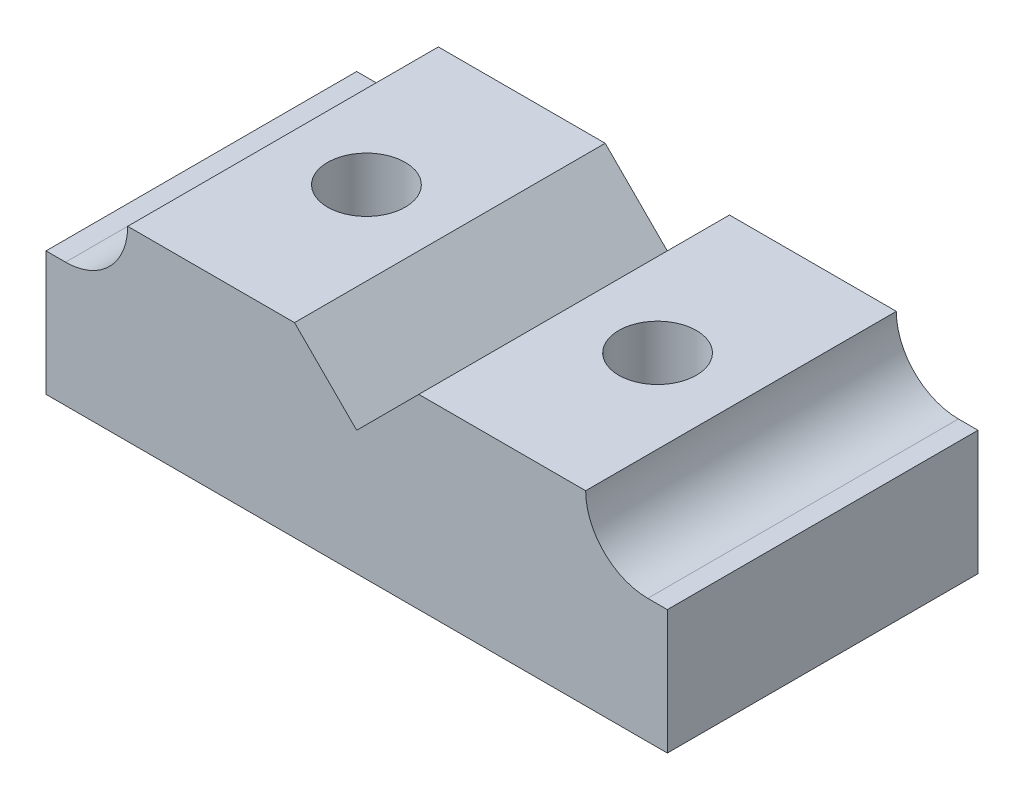
ISO-10303-21;
HEADER;
FILE_DESCRIPTION(('STEP AP214'),'2;1');
FILE_NAME('part.step','',(''),(''),'','','');
FILE_SCHEMA(('AUTOMOTIVE_DESIGN { 1 0 10303 214 1 1 1 1 }'));
ENDSEC;
DATA;
#1=APPLICATION_CONTEXT('core data for automotive mechanical design processes');
#2=APPLICATION_PROTOCOL_DEFINITION('international standard','automotive_design',2000,#1);
#3=PRODUCT_CONTEXT('',#1,'mechanical');
#4=PRODUCT('Part','Part','',(#3));
#5=PRODUCT_RELATED_PRODUCT_CATEGORY('part','',(#4));
#6=PRODUCT_DEFINITION_FORMATION('','',#4);
#7=PRODUCT_DEFINITION_CONTEXT('part definition',#1,'design');
#8=PRODUCT_DEFINITION('design','',#6,#7);
#9=PRODUCT_DEFINITION_SHAPE('','',#8);
#10=(LENGTH_UNIT() NAMED_UNIT(*) SI_UNIT(.MILLI.,.METRE.));
#11=(NAMED_UNIT(*) PLANE_ANGLE_UNIT() SI_UNIT($,.RADIAN.));
#12=(NAMED_UNIT(*) SI_UNIT($,.STERADIAN.) SOLID_ANGLE_UNIT());
#13=UNCERTAINTY_MEASURE_WITH_UNIT(LENGTH_MEASURE(1.E-05),#10,'distance_accuracy_value','');
#14=(GEOMETRIC_REPRESENTATION_CONTEXT(3) GLOBAL_UNCERTAINTY_ASSIGNED_CONTEXT((#13)) GLOBAL_UNIT_ASSIGNED_CONTEXT((#10,
#11,#12)) REPRESENTATION_CONTEXT('',''));
#15=CARTESIAN_POINT('',(0.,0.,0.));
#16=DIRECTION('',(0.,0.,1.));
#17=DIRECTION('',(1.,0.,0.));
#18=AXIS2_PLACEMENT_3D('',#15,#16,#17);
#19=CARTESIAN_POINT('',(-10.,4.,-5.));
#20=DIRECTION('',(0.,0.,1.));
#21=DIRECTION('',(1.,0.,0.));
#22=AXIS2_PLACEMENT_3D('',#19,#20,#21);
#23=PLANE('',#22);
#24=DIRECTION('',(-0.70678554226454,0.707427874235826,0.));
#25=VECTOR('',#24,1.);
#26=CARTESIAN_POINT('',(1.99909036773728,1.99727522911544,-5.));
#27=LINE('',#26,#25);
#28=CARTESIAN_POINT('',(0.,3.99818238508607,-5.));
#29=VERTEX_POINT('',#28);
#30=CARTESIAN_POINT('',(-2.,6.,-5.));
#31=VERTEX_POINT('',#30);
#32=EDGE_CURVE('E117',#29,#31,#27,.T.);
#33=ORIENTED_EDGE('',*,*,#32,.F.);
#34=DIRECTION('',(0.70678554226454,0.707427874235826,0.));
#35=VECTOR('',#34,1.);
#36=CARTESIAN_POINT('',(-1.99909036773728,1.99727522911544,-5.));
#37=LINE('',#36,#35);
#38=CARTESIAN_POINT('',(2.,6.,-5.));
#39=VERTEX_POINT('',#38);
#40=EDGE_CURVE('E124',#29,#39,#37,.T.);
#41=ORIENTED_EDGE('',*,*,#40,.T.);
#42=DIRECTION('',(-1.,0.,0.));
#43=VECTOR('',#42,1.);
#44=CARTESIAN_POINT('',(-7.37092938330195,6.,-5.));
#45=LINE('',#44,#43);
#46=CARTESIAN_POINT('',(7.37092938330195,6.,-5.));
#47=VERTEX_POINT('',#46);
#48=EDGE_CURVE('E149',#47,#39,#45,.T.);
#49=ORIENTED_EDGE('',*,*,#48,.F.);
#50=CARTESIAN_POINT('',(9.37092938330195,6.,-5.));
#51=DIRECTION('',(0.,0.,1.));
#52=DIRECTION('',(1.,0.,0.));
#53=AXIS2_PLACEMENT_3D('',#50,#51,#52);
#54=CIRCLE('',#53,2.);
#55=CARTESIAN_POINT('',(9.37092938330195,4.,-5.));
#56=VERTEX_POINT('',#55);
#57=EDGE_CURVE('E41',#47,#56,#54,.T.);
#58=ORIENTED_EDGE('',*,*,#57,.T.);
#59=DIRECTION('',(-1.,0.,0.));
#60=VECTOR('',#59,1.);
#61=CARTESIAN_POINT('',(-10.,4.,-5.));
#62=LINE('',#61,#60);
#63=CARTESIAN_POINT('',(10.,4.,-5.));
#64=VERTEX_POINT('',#63);
#65=EDGE_CURVE('E173',#64,#56,#62,.T.);
#66=ORIENTED_EDGE('',*,*,#65,.F.);
#67=DIRECTION('',(0.,-1.,0.));
#68=VECTOR('',#67,1.);
#69=CARTESIAN_POINT('',(10.,4.,-5.));
#70=LINE('',#69,#68);
#71=CARTESIAN_POINT('',(10.,0.,-5.));
#72=VERTEX_POINT('',#71);
#73=EDGE_CURVE('E176',#64,#72,#70,.T.);
#74=ORIENTED_EDGE('',*,*,#73,.T.);
#75=DIRECTION('',(-1.,0.,0.));
#76=VECTOR('',#75,1.);
#77=CARTESIAN_POINT('',(-10.,0.,-5.));
#78=LINE('',#77,#76);
#79=CARTESIAN_POINT('',(-10.,0.,-5.));
#80=VERTEX_POINT('',#79);
#81=EDGE_CURVE('E224',#72,#80,#78,.T.);
#82=ORIENTED_EDGE('',*,*,#81,.T.);
#83=DIRECTION('',(0.,-1.,0.));
#84=VECTOR('',#83,1.);
#85=CARTESIAN_POINT('',(-10.,4.,-5.));
#86=LINE('',#85,#84);
#87=CARTESIAN_POINT('',(-10.,4.,-5.));
#88=VERTEX_POINT('',#87);
#89=EDGE_CURVE('E218',#88,#80,#86,.T.);
#90=ORIENTED_EDGE('',*,*,#89,.F.);
#91=CARTESIAN_POINT('',(-9.37092938330195,4.,-5.));
#92=VERTEX_POINT('',#91);
#93=EDGE_CURVE('E162',#92,#88,#62,.T.);
#94=ORIENTED_EDGE('',*,*,#93,.F.);
#95=CARTESIAN_POINT('',(-9.37092938330195,6.,-5.));
#96=DIRECTION('',(0.,0.,1.));
#97=DIRECTION('',(1.,0.,0.));
#98=AXIS2_PLACEMENT_3D('',#95,#96,#97);
#99=CIRCLE('',#98,2.);
#100=CARTESIAN_POINT('',(-7.37092938330195,6.,-5.));
#101=VERTEX_POINT('',#100);
#102=EDGE_CURVE('E192',#92,#101,#99,.T.);
#103=ORIENTED_EDGE('',*,*,#102,.T.);
#104=EDGE_CURVE('E133',#31,#101,#45,.T.);
#105=ORIENTED_EDGE('',*,*,#104,.F.);
#106=EDGE_LOOP('',(#33,#41,#49,#58,#66,#74,#82,#90,#94,#103,#105));
#107=FACE_BOUND('',#106,.T.);
#108=ADVANCED_FACE('F33',(#107),#23,.F.);
#109=CARTESIAN_POINT('',(-10.,4.,5.));
#110=DIRECTION('',(0.,0.,-1.));
#111=DIRECTION('',(-1.,0.,0.));
#112=AXIS2_PLACEMENT_3D('',#109,#110,#111);
#113=PLANE('',#112);
#114=DIRECTION('',(-0.70678554226454,0.707427874235826,0.));
#115=VECTOR('',#114,1.);
#116=CARTESIAN_POINT('',(1.99909036773728,1.99727522911544,5.));
#117=LINE('',#116,#115);
#118=CARTESIAN_POINT('',(0.,3.99818238508607,5.));
#119=VERTEX_POINT('',#118);
#120=CARTESIAN_POINT('',(-2.,6.,5.));
#121=VERTEX_POINT('',#120);
#122=EDGE_CURVE('E120',#119,#121,#117,.T.);
#123=ORIENTED_EDGE('',*,*,#122,.T.);
#124=DIRECTION('',(1.,0.,0.));
#125=VECTOR('',#124,1.);
#126=CARTESIAN_POINT('',(-7.37092938330195,6.,5.));
#127=LINE('',#126,#125);
#128=CARTESIAN_POINT('',(-7.37092938330195,6.,5.));
#129=VERTEX_POINT('',#128);
#130=EDGE_CURVE('E155',#129,#121,#127,.T.);
#131=ORIENTED_EDGE('',*,*,#130,.F.);
#132=CARTESIAN_POINT('',(-9.37092938330195,6.,5.));
#133=DIRECTION('',(0.,0.,-1.));
#134=DIRECTION('',(-1.,0.,0.));
#135=AXIS2_PLACEMENT_3D('',#132,#133,#134);
#136=CIRCLE('',#135,2.);
#137=CARTESIAN_POINT('',(-9.37092938330195,4.,5.));
#138=VERTEX_POINT('',#137);
#139=EDGE_CURVE('E190',#129,#138,#136,.T.);
#140=ORIENTED_EDGE('',*,*,#139,.T.);
#141=DIRECTION('',(1.,0.,0.));
#142=VECTOR('',#141,1.);
#143=CARTESIAN_POINT('',(-10.,4.,5.));
#144=LINE('',#143,#142);
#145=CARTESIAN_POINT('',(-10.,4.,5.));
#146=VERTEX_POINT('',#145);
#147=EDGE_CURVE('E178',#146,#138,#144,.T.);
#148=ORIENTED_EDGE('',*,*,#147,.F.);
#149=DIRECTION('',(0.,-1.,0.));
#150=VECTOR('',#149,1.);
#151=CARTESIAN_POINT('',(-10.,4.,5.));
#152=LINE('',#151,#150);
#153=CARTESIAN_POINT('',(-10.,0.,5.));
#154=VERTEX_POINT('',#153);
#155=EDGE_CURVE('E213',#146,#154,#152,.T.);
#156=ORIENTED_EDGE('',*,*,#155,.T.);
#157=DIRECTION('',(1.,0.,0.));
#158=VECTOR('',#157,1.);
#159=CARTESIAN_POINT('',(-10.,0.,5.));
#160=LINE('',#159,#158);
#161=CARTESIAN_POINT('',(10.,0.,5.));
#162=VERTEX_POINT('',#161);
#163=EDGE_CURVE('E163',#154,#162,#160,.T.);
#164=ORIENTED_EDGE('',*,*,#163,.T.);
#165=DIRECTION('',(0.,-1.,0.));
#166=VECTOR('',#165,1.);
#167=CARTESIAN_POINT('',(10.,4.,5.));
#168=LINE('',#167,#166);
#169=CARTESIAN_POINT('',(10.,4.,5.));
#170=VERTEX_POINT('',#169);
#171=EDGE_CURVE('E180',#170,#162,#168,.T.);
#172=ORIENTED_EDGE('',*,*,#171,.F.);
#173=CARTESIAN_POINT('',(9.37092938330195,4.,5.));
#174=VERTEX_POINT('',#173);
#175=EDGE_CURVE('E181',#174,#170,#144,.T.);
#176=ORIENTED_EDGE('',*,*,#175,.F.);
#177=CARTESIAN_POINT('',(9.37092938330195,6.,5.));
#178=DIRECTION('',(0.,0.,-1.));
#179=DIRECTION('',(-1.,0.,0.));
#180=AXIS2_PLACEMENT_3D('',#177,#178,#179);
#181=CIRCLE('',#180,2.);
#182=CARTESIAN_POINT('',(7.37092938330195,6.,5.));
#183=VERTEX_POINT('',#182);
#184=EDGE_CURVE('E11',#174,#183,#181,.T.);
#185=ORIENTED_EDGE('',*,*,#184,.T.);
#186=CARTESIAN_POINT('',(2.,6.,5.));
#187=VERTEX_POINT('',#186);
#188=EDGE_CURVE('E154',#187,#183,#127,.T.);
#189=ORIENTED_EDGE('',*,*,#188,.F.);
#190=DIRECTION('',(0.70678554226454,0.707427874235826,0.));
#191=VECTOR('',#190,1.);
#192=CARTESIAN_POINT('',(-1.99909036773728,1.99727522911544,5.));
#193=LINE('',#192,#191);
#194=EDGE_CURVE('E134',#119,#187,#193,.T.);
#195=ORIENTED_EDGE('',*,*,#194,.F.);
#196=EDGE_LOOP('',(#123,#131,#140,#148,#156,#164,#172,#176,#185,#189,#195));
#197=FACE_BOUND('',#196,.T.);
#198=ADVANCED_FACE('F205',(#197),#113,.F.);
#199=CARTESIAN_POINT('',(0.,6.,0.));
#200=DIRECTION('',(0.,1.,0.));
#201=DIRECTION('',(0.,0.,1.));
#202=AXIS2_PLACEMENT_3D('',#199,#200,#201);
#203=PLANE('',#202);
#204=CARTESIAN_POINT('',(-4.68546469165098,6.,0.));
#205=DIRECTION('',(0.,1.,0.));
#206=DIRECTION('',(0.,0.,1.));
#207=AXIS2_PLACEMENT_3D('',#204,#205,#206);
#208=CIRCLE('',#207,1.25);
#209=CARTESIAN_POINT('',(-4.68546469165098,6.,1.25));
#210=VERTEX_POINT('',#209);
#211=EDGE_CURVE('E138',#210,#210,#208,.T.);
#212=ORIENTED_EDGE('',*,*,#211,.F.);
#213=EDGE_LOOP('',(#212));
#214=FACE_BOUND('',#213,.T.);
#215=ORIENTED_EDGE('',*,*,#130,.T.);
#216=DIRECTION('',(0.,0.,1.));
#217=VECTOR('',#216,1.);
#218=CARTESIAN_POINT('',(-2.,6.,-5.));
#219=LINE('',#218,#217);
#220=EDGE_CURVE('E143',#31,#121,#219,.T.);
#221=ORIENTED_EDGE('',*,*,#220,.F.);
#222=ORIENTED_EDGE('',*,*,#104,.T.);
#223=DIRECTION('',(0.,0.,1.));
#224=VECTOR('',#223,1.);
#225=CARTESIAN_POINT('',(-7.37092938330195,6.,-5.));
#226=LINE('',#225,#224);
#227=EDGE_CURVE('E151',#101,#129,#226,.T.);
#228=ORIENTED_EDGE('',*,*,#227,.T.);
#229=EDGE_LOOP('',(#215,#221,#222,#228));
#230=FACE_BOUND('',#229,.T.);
#231=ADVANCED_FACE('F200',(#214,#230),#203,.T.);
#232=CARTESIAN_POINT('',(0.,4.,0.));
#233=DIRECTION('',(0.,1.,0.));
#234=DIRECTION('',(0.,0.,1.));
#235=AXIS2_PLACEMENT_3D('',#232,#233,#234);
#236=PLANE('',#235);
#237=ORIENTED_EDGE('',*,*,#65,.T.);
#238=DIRECTION('',(0.,0.,-1.));
#239=VECTOR('',#238,1.);
#240=CARTESIAN_POINT('',(9.37092938330195,4.,0.));
#241=LINE('',#240,#239);
#242=EDGE_CURVE('E54',#56,#174,#241,.F.);
#243=ORIENTED_EDGE('',*,*,#242,.T.);
#244=ORIENTED_EDGE('',*,*,#175,.T.);
#245=DIRECTION('',(0.,0.,-1.));
#246=VECTOR('',#245,1.);
#247=CARTESIAN_POINT('',(10.,4.,-5.));
#248=LINE('',#247,#246);
#249=EDGE_CURVE('E159',#170,#64,#248,.T.);
#250=ORIENTED_EDGE('',*,*,#249,.T.);
#251=EDGE_LOOP('',(#237,#243,#244,#250));
#252=FACE_BOUND('',#251,.T.);
#253=ADVANCED_FACE('F235',(#252),#236,.T.);
#254=CARTESIAN_POINT('',(10.,4.,-5.));
#255=DIRECTION('',(-1.,0.,0.));
#256=DIRECTION('',(0.,0.,1.));
#257=AXIS2_PLACEMENT_3D('',#254,#255,#256);
#258=PLANE('',#257);
#259=DIRECTION('',(0.,0.,-1.));
#260=VECTOR('',#259,1.);
#261=CARTESIAN_POINT('',(10.,0.,-5.));
#262=LINE('',#261,#260);
#263=EDGE_CURVE('E158',#162,#72,#262,.T.);
#264=ORIENTED_EDGE('',*,*,#263,.T.);
#265=ORIENTED_EDGE('',*,*,#73,.F.);
#266=ORIENTED_EDGE('',*,*,#249,.F.);
#267=ORIENTED_EDGE('',*,*,#171,.T.);
#268=EDGE_LOOP('',(#264,#265,#266,#267));
#269=FACE_BOUND('',#268,.T.);
#270=ADVANCED_FACE('F230',(#269),#258,.F.);
#271=CARTESIAN_POINT('',(-10.,4.,-5.));
#272=DIRECTION('',(1.,0.,0.));
#273=DIRECTION('',(0.,0.,-1.));
#274=AXIS2_PLACEMENT_3D('',#271,#272,#273);
#275=PLANE('',#274);
#276=DIRECTION('',(0.,0.,1.));
#277=VECTOR('',#276,1.);
#278=CARTESIAN_POINT('',(-10.,0.,-5.));
#279=LINE('',#278,#277);
#280=EDGE_CURVE('E216',#80,#154,#279,.T.);
#281=ORIENTED_EDGE('',*,*,#280,.T.);
#282=ORIENTED_EDGE('',*,*,#155,.F.);
#283=DIRECTION('',(0.,0.,1.));
#284=VECTOR('',#283,1.);
#285=CARTESIAN_POINT('',(-10.,4.,-5.));
#286=LINE('',#285,#284);
#287=EDGE_CURVE('E166',#88,#146,#286,.T.);
#288=ORIENTED_EDGE('',*,*,#287,.F.);
#289=ORIENTED_EDGE('',*,*,#89,.T.);
#290=EDGE_LOOP('',(#281,#282,#288,#289));
#291=FACE_BOUND('',#290,.T.);
#292=ADVANCED_FACE('F214',(#291),#275,.F.);
#293=ORIENTED_EDGE('',*,*,#147,.T.);
#294=DIRECTION('',(0.,0.,1.));
#295=VECTOR('',#294,1.);
#296=CARTESIAN_POINT('',(-9.37092938330195,4.,0.));
#297=LINE('',#296,#295);
#298=EDGE_CURVE('E188',#138,#92,#297,.F.);
#299=ORIENTED_EDGE('',*,*,#298,.T.);
#300=ORIENTED_EDGE('',*,*,#93,.T.);
#301=ORIENTED_EDGE('',*,*,#287,.T.);
#302=EDGE_LOOP('',(#293,#299,#300,#301));
#303=FACE_BOUND('',#302,.T.);
#304=ADVANCED_FACE('F208',(#303),#236,.T.);
#305=CARTESIAN_POINT('',(0.,0.,0.));
#306=DIRECTION('',(0.,1.,0.));
#307=DIRECTION('',(0.,0.,1.));
#308=AXIS2_PLACEMENT_3D('',#305,#306,#307);
#309=PLANE('',#308);
#310=CARTESIAN_POINT('',(4.68546469165098,0.,0.));
#311=DIRECTION('',(0.,1.,0.));
#312=DIRECTION('',(0.,0.,1.));
#313=AXIS2_PLACEMENT_3D('',#310,#311,#312);
#314=CIRCLE('',#313,1.25);
#315=CARTESIAN_POINT('',(4.68546469165098,0.,1.25));
#316=VERTEX_POINT('',#315);
#317=EDGE_CURVE('E378',#316,#316,#314,.T.);
#318=ORIENTED_EDGE('',*,*,#317,.T.);
#319=EDGE_LOOP('',(#318));
#320=FACE_BOUND('',#319,.T.);
#321=CARTESIAN_POINT('',(-4.68546469165098,0.,0.));
#322=DIRECTION('',(0.,1.,0.));
#323=DIRECTION('',(0.,0.,1.));
#324=AXIS2_PLACEMENT_3D('',#321,#322,#323);
#325=CIRCLE('',#324,1.25);
#326=CARTESIAN_POINT('',(-4.68546469165098,0.,1.25));
#327=VERTEX_POINT('',#326);
#328=EDGE_CURVE('E141',#327,#327,#325,.T.);
#329=ORIENTED_EDGE('',*,*,#328,.T.);
#330=EDGE_LOOP('',(#329));
#331=FACE_BOUND('',#330,.T.);
#332=ORIENTED_EDGE('',*,*,#263,.F.);
#333=ORIENTED_EDGE('',*,*,#163,.F.);
#334=ORIENTED_EDGE('',*,*,#280,.F.);
#335=ORIENTED_EDGE('',*,*,#81,.F.);
#336=EDGE_LOOP('',(#332,#333,#334,#335));
#337=FACE_BOUND('',#336,.T.);
#338=ADVANCED_FACE('F234',(#320,#331,#337),#309,.F.);
#339=CARTESIAN_POINT('',(4.68546469165098,6.,0.));
#340=DIRECTION('',(0.,1.,0.));
#341=DIRECTION('',(0.,0.,1.));
#342=AXIS2_PLACEMENT_3D('',#339,#340,#341);
#343=CIRCLE('',#342,1.25);
#344=CARTESIAN_POINT('',(4.68546469165098,6.,1.25));
#345=VERTEX_POINT('',#344);
#346=EDGE_CURVE('E375',#345,#345,#343,.T.);
#347=ORIENTED_EDGE('',*,*,#346,.F.);
#348=EDGE_LOOP('',(#347));
#349=FACE_BOUND('',#348,.T.);
#350=DIRECTION('',(0.,0.,1.));
#351=VECTOR('',#350,1.);
#352=CARTESIAN_POINT('',(2.,6.,-5.));
#353=LINE('',#352,#351);
#354=EDGE_CURVE('E123',#39,#187,#353,.T.);
#355=ORIENTED_EDGE('',*,*,#354,.T.);
#356=ORIENTED_EDGE('',*,*,#188,.T.);
#357=DIRECTION('',(0.,0.,-1.));
#358=VECTOR('',#357,1.);
#359=CARTESIAN_POINT('',(7.37092938330195,6.,-5.));
#360=LINE('',#359,#358);
#361=EDGE_CURVE('E145',#183,#47,#360,.T.);
#362=ORIENTED_EDGE('',*,*,#361,.T.);
#363=ORIENTED_EDGE('',*,*,#48,.T.);
#364=EDGE_LOOP('',(#355,#356,#362,#363));
#365=FACE_BOUND('',#364,.T.);
#366=ADVANCED_FACE('F242',(#349,#365),#203,.T.);
#367=CARTESIAN_POINT('',(1.99909036773728,1.99727522911544,-5.));
#368=DIRECTION('',(0.707427874235826,0.70678554226454,0.));
#369=DIRECTION('',(-0.70678554226454,0.707427874235826,0.));
#370=AXIS2_PLACEMENT_3D('',#367,#368,#369);
#371=PLANE('',#370);
#372=ORIENTED_EDGE('',*,*,#122,.F.);
#373=DIRECTION('',(0.,0.,1.));
#374=VECTOR('',#373,1.);
#375=CARTESIAN_POINT('',(0.,3.99818238508607,-5.));
#376=LINE('',#375,#374);
#377=EDGE_CURVE('E113',#29,#119,#376,.T.);
#378=ORIENTED_EDGE('',*,*,#377,.F.);
#379=ORIENTED_EDGE('',*,*,#32,.T.);
#380=ORIENTED_EDGE('',*,*,#220,.T.);
#381=EDGE_LOOP('',(#372,#378,#379,#380));
#382=FACE_BOUND('',#381,.T.);
#383=ADVANCED_FACE('F115',(#382),#371,.T.);
#384=CARTESIAN_POINT('',(-1.99909036773728,1.99727522911544,-5.));
#385=DIRECTION('',(0.707427874235826,-0.70678554226454,0.));
#386=DIRECTION('',(0.70678554226454,0.707427874235826,0.));
#387=AXIS2_PLACEMENT_3D('',#384,#385,#386);
#388=PLANE('',#387);
#389=ORIENTED_EDGE('',*,*,#194,.T.);
#390=ORIENTED_EDGE('',*,*,#354,.F.);
#391=ORIENTED_EDGE('',*,*,#40,.F.);
#392=ORIENTED_EDGE('',*,*,#377,.T.);
#393=EDGE_LOOP('',(#389,#390,#391,#392));
#394=FACE_BOUND('',#393,.T.);
#395=ADVANCED_FACE('F127',(#394),#388,.F.);
#396=CARTESIAN_POINT('',(-4.68546469165098,-4.,0.));
#397=DIRECTION('',(0.,1.,0.));
#398=DIRECTION('',(0.,0.,1.));
#399=AXIS2_PLACEMENT_3D('',#396,#397,#398);
#400=CYLINDRICAL_SURFACE('',#399,1.25);
#401=ORIENTED_EDGE('',*,*,#211,.T.);
#402=EDGE_LOOP('',(#401));
#403=FACE_BOUND('',#402,.T.);
#404=ORIENTED_EDGE('',*,*,#328,.F.);
#405=EDGE_LOOP('',(#404));
#406=FACE_BOUND('',#405,.T.);
#407=ADVANCED_FACE('F272',(#403,#406),#400,.F.);
#408=CARTESIAN_POINT('',(4.68546469165098,-4.,0.));
#409=DIRECTION('',(0.,1.,0.));
#410=DIRECTION('',(0.,0.,1.));
#411=AXIS2_PLACEMENT_3D('',#408,#409,#410);
#412=CYLINDRICAL_SURFACE('',#411,1.25);
#413=ORIENTED_EDGE('',*,*,#346,.T.);
#414=EDGE_LOOP('',(#413));
#415=FACE_BOUND('',#414,.T.);
#416=ORIENTED_EDGE('',*,*,#317,.F.);
#417=EDGE_LOOP('',(#416));
#418=FACE_BOUND('',#417,.T.);
#419=ADVANCED_FACE('F267',(#415,#418),#412,.F.);
#420=CARTESIAN_POINT('',(-9.37092938330195,6.,-5.));
#421=DIRECTION('',(0.,0.,1.));
#422=DIRECTION('',(1.,0.,0.));
#423=AXIS2_PLACEMENT_3D('',#420,#421,#422);
#424=CYLINDRICAL_SURFACE('',#423,2.);
#425=ORIENTED_EDGE('',*,*,#102,.F.);
#426=ORIENTED_EDGE('',*,*,#298,.F.);
#427=ORIENTED_EDGE('',*,*,#139,.F.);
#428=ORIENTED_EDGE('',*,*,#227,.F.);
#429=EDGE_LOOP('',(#425,#426,#427,#428));
#430=FACE_BOUND('',#429,.T.);
#431=ADVANCED_FACE('F202',(#430),#424,.F.);
#432=CARTESIAN_POINT('',(9.37092938330195,6.,-5.));
#433=DIRECTION('',(0.,0.,-1.));
#434=DIRECTION('',(-1.,0.,0.));
#435=AXIS2_PLACEMENT_3D('',#432,#433,#434);
#436=CYLINDRICAL_SURFACE('',#435,2.);
#437=ORIENTED_EDGE('',*,*,#184,.F.);
#438=ORIENTED_EDGE('',*,*,#242,.F.);
#439=ORIENTED_EDGE('',*,*,#57,.F.);
#440=ORIENTED_EDGE('',*,*,#361,.F.);
#441=EDGE_LOOP('',(#437,#438,#439,#440));
#442=FACE_BOUND('',#441,.T.);
#443=ADVANCED_FACE('F35',(#442),#436,.F.);
#444=CLOSED_SHELL('',(#108,#198,#231,#253,#270,#292,#304,#338,#366,#383,#395,#407,#419,#431,#443));
#445=MANIFOLD_SOLID_BREP('B2',#444);
#446=ADVANCED_BREP_SHAPE_REPRESENTATION('',(#18,#445),#14);
#447=SHAPE_DEFINITION_REPRESENTATION(#9,#446);
ENDSEC;
END-ISO-10303-21;
